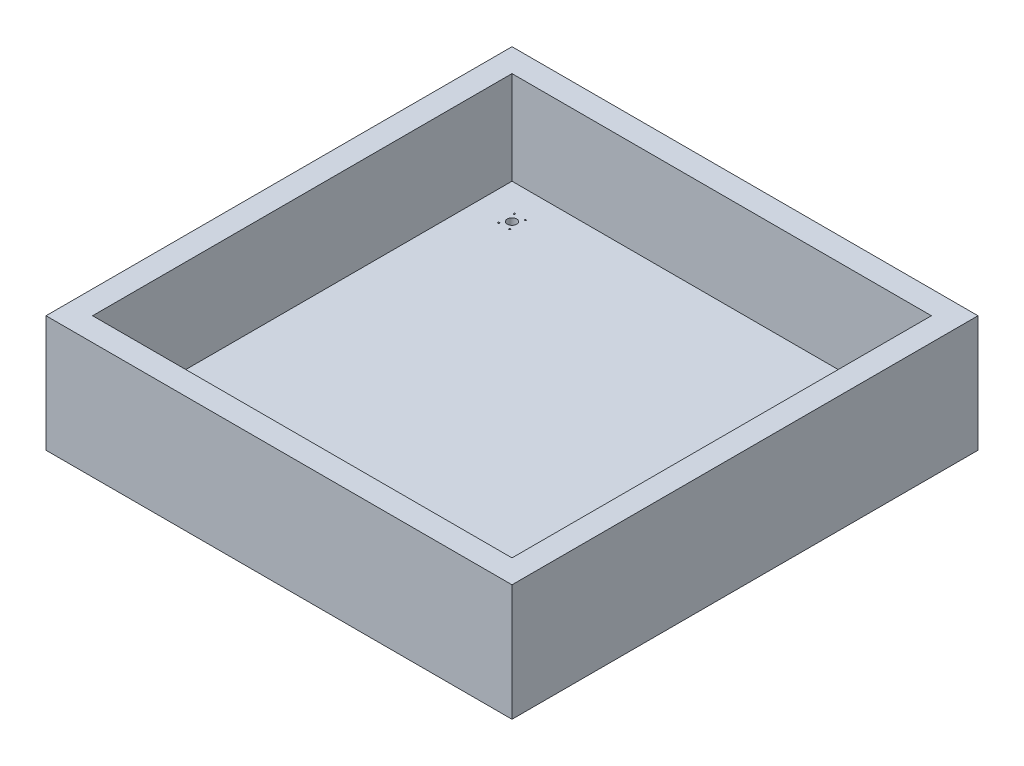
ISO-10303-21;
HEADER;
FILE_DESCRIPTION(('STEP AP214'),'2;1');
FILE_NAME('part.step','',(''),(''),'','','');
FILE_SCHEMA(('AUTOMOTIVE_DESIGN { 1 0 10303 214 1 1 1 1 }'));
ENDSEC;
DATA;
#1=APPLICATION_CONTEXT('core data for automotive mechanical design processes');
#2=APPLICATION_PROTOCOL_DEFINITION('international standard','automotive_design',2000,#1);
#3=PRODUCT_CONTEXT('',#1,'mechanical');
#4=PRODUCT('Part','Part','',(#3));
#5=PRODUCT_RELATED_PRODUCT_CATEGORY('part','',(#4));
#6=PRODUCT_DEFINITION_FORMATION('','',#4);
#7=PRODUCT_DEFINITION_CONTEXT('part definition',#1,'design');
#8=PRODUCT_DEFINITION('design','',#6,#7);
#9=PRODUCT_DEFINITION_SHAPE('','',#8);
#10=(LENGTH_UNIT() NAMED_UNIT(*) SI_UNIT(.MILLI.,.METRE.));
#11=(NAMED_UNIT(*) PLANE_ANGLE_UNIT() SI_UNIT($,.RADIAN.));
#12=(NAMED_UNIT(*) SI_UNIT($,.STERADIAN.) SOLID_ANGLE_UNIT());
#13=UNCERTAINTY_MEASURE_WITH_UNIT(LENGTH_MEASURE(1.E-05),#10,'distance_accuracy_value','');
#14=(GEOMETRIC_REPRESENTATION_CONTEXT(3) GLOBAL_UNCERTAINTY_ASSIGNED_CONTEXT((#13)) GLOBAL_UNIT_ASSIGNED_CONTEXT((#10,
#11,#12)) REPRESENTATION_CONTEXT('',''));
#15=CARTESIAN_POINT('',(0.,0.,0.));
#16=DIRECTION('',(0.,0.,1.));
#17=DIRECTION('',(1.,0.,0.));
#18=AXIS2_PLACEMENT_3D('',#15,#16,#17);
#19=CARTESIAN_POINT('',(0.,0.,0.));
#20=DIRECTION('',(0.,-1.,0.));
#21=DIRECTION('',(0.,0.,-1.));
#22=AXIS2_PLACEMENT_3D('',#19,#20,#21);
#23=PLANE('',#22);
#24=CARTESIAN_POINT('',(-184.596,0.,-199.126));
#25=DIRECTION('',(0.,1.,0.));
#26=DIRECTION('',(0.,0.,1.));
#27=AXIS2_PLACEMENT_3D('',#24,#25,#26);
#28=CIRCLE('',#27,0.799999999999981);
#29=CARTESIAN_POINT('',(-184.596,0.,-198.326));
#30=VERTEX_POINT('',#29);
#31=EDGE_CURVE('E293',#30,#30,#28,.T.);
#32=ORIENTED_EDGE('',*,*,#31,.F.);
#33=EDGE_LOOP('',(#32));
#34=FACE_BOUND('',#33,.T.);
#35=CARTESIAN_POINT('',(-190.5,0.,-190.5));
#36=DIRECTION('',(0.,1.,0.));
#37=DIRECTION('',(0.,0.,1.));
#38=AXIS2_PLACEMENT_3D('',#35,#36,#37);
#39=CIRCLE('',#38,5.07999999999999);
#40=CARTESIAN_POINT('',(-190.5,0.,-185.42));
#41=VERTEX_POINT('',#40);
#42=EDGE_CURVE('E299',#41,#41,#39,.T.);
#43=ORIENTED_EDGE('',*,*,#42,.F.);
#44=EDGE_LOOP('',(#43));
#45=FACE_BOUND('',#44,.T.);
#46=CARTESIAN_POINT('',(-184.596,0.,-182.126));
#47=DIRECTION('',(0.,1.,0.));
#48=DIRECTION('',(0.,0.,1.));
#49=AXIS2_PLACEMENT_3D('',#46,#47,#48);
#50=CIRCLE('',#49,0.799999999999981);
#51=CARTESIAN_POINT('',(-184.596,0.,-181.326));
#52=VERTEX_POINT('',#51);
#53=EDGE_CURVE('E305',#52,#52,#50,.T.);
#54=ORIENTED_EDGE('',*,*,#53,.F.);
#55=EDGE_LOOP('',(#54));
#56=FACE_BOUND('',#55,.T.);
#57=CARTESIAN_POINT('',(-196.596,0.,-182.126));
#58=DIRECTION('',(0.,1.,0.));
#59=DIRECTION('',(0.,0.,1.));
#60=AXIS2_PLACEMENT_3D('',#57,#58,#59);
#61=CIRCLE('',#60,0.799999999999981);
#62=CARTESIAN_POINT('',(-196.596,0.,-181.326));
#63=VERTEX_POINT('',#62);
#64=EDGE_CURVE('E311',#63,#63,#61,.T.);
#65=ORIENTED_EDGE('',*,*,#64,.F.);
#66=EDGE_LOOP('',(#65));
#67=FACE_BOUND('',#66,.T.);
#68=CARTESIAN_POINT('',(190.5,0.,190.5));
#69=DIRECTION('',(0.,1.,0.));
#70=DIRECTION('',(0.,0.,1.));
#71=AXIS2_PLACEMENT_3D('',#68,#69,#70);
#72=CIRCLE('',#71,5.07999999999999);
#73=CARTESIAN_POINT('',(190.5,0.,195.58));
#74=VERTEX_POINT('',#73);
#75=EDGE_CURVE('E279',#74,#74,#72,.T.);
#76=ORIENTED_EDGE('',*,*,#75,.F.);
#77=EDGE_LOOP('',(#76));
#78=FACE_BOUND('',#77,.T.);
#79=CARTESIAN_POINT('',(-196.596,0.,-199.126));
#80=DIRECTION('',(0.,1.,0.));
#81=DIRECTION('',(0.,0.,1.));
#82=AXIS2_PLACEMENT_3D('',#79,#80,#81);
#83=CIRCLE('',#82,0.799999999999981);
#84=CARTESIAN_POINT('',(-196.596,0.,-198.326));
#85=VERTEX_POINT('',#84);
#86=EDGE_CURVE('E132',#85,#85,#83,.T.);
#87=ORIENTED_EDGE('',*,*,#86,.F.);
#88=EDGE_LOOP('',(#87));
#89=FACE_BOUND('',#88,.T.);
#90=DIRECTION('',(-1.,0.,0.));
#91=VECTOR('',#90,1.);
#92=CARTESIAN_POINT('',(228.6,0.,-228.6));
#93=LINE('',#92,#91);
#94=CARTESIAN_POINT('',(228.6,0.,-228.6));
#95=VERTEX_POINT('',#94);
#96=CARTESIAN_POINT('',(-228.6,0.,-228.6));
#97=VERTEX_POINT('',#96);
#98=EDGE_CURVE('E142',#95,#97,#93,.T.);
#99=ORIENTED_EDGE('',*,*,#98,.T.);
#100=DIRECTION('',(0.,0.,1.));
#101=VECTOR('',#100,1.);
#102=CARTESIAN_POINT('',(-228.6,0.,228.6));
#103=LINE('',#102,#101);
#104=CARTESIAN_POINT('',(-228.6,0.,228.6));
#105=VERTEX_POINT('',#104);
#106=EDGE_CURVE('E138',#97,#105,#103,.T.);
#107=ORIENTED_EDGE('',*,*,#106,.T.);
#108=DIRECTION('',(1.,0.,0.));
#109=VECTOR('',#108,1.);
#110=CARTESIAN_POINT('',(228.6,0.,228.6));
#111=LINE('',#110,#109);
#112=CARTESIAN_POINT('',(228.6,0.,228.6));
#113=VERTEX_POINT('',#112);
#114=EDGE_CURVE('E151',#105,#113,#111,.T.);
#115=ORIENTED_EDGE('',*,*,#114,.T.);
#116=DIRECTION('',(0.,0.,-1.));
#117=VECTOR('',#116,1.);
#118=CARTESIAN_POINT('',(228.6,0.,228.6));
#119=LINE('',#118,#117);
#120=EDGE_CURVE('E154',#113,#95,#119,.T.);
#121=ORIENTED_EDGE('',*,*,#120,.T.);
#122=EDGE_LOOP('',(#99,#107,#115,#121));
#123=FACE_BOUND('',#122,.T.);
#124=CARTESIAN_POINT('',(-190.5,0.,190.5));
#125=DIRECTION('',(0.,-1.,0.));
#126=DIRECTION('',(0.,0.,-1.));
#127=AXIS2_PLACEMENT_3D('',#124,#125,#126);
#128=CIRCLE('',#127,5.07999999999999);
#129=CARTESIAN_POINT('',(-190.5,0.,185.42));
#130=VERTEX_POINT('',#129);
#131=EDGE_CURVE('E287',#130,#130,#128,.T.);
#132=ORIENTED_EDGE('',*,*,#131,.T.);
#133=EDGE_LOOP('',(#132));
#134=FACE_BOUND('',#133,.T.);
#135=CARTESIAN_POINT('',(196.596,0.,-199.126));
#136=DIRECTION('',(0.,-1.,0.));
#137=DIRECTION('',(0.,0.,-1.));
#138=AXIS2_PLACEMENT_3D('',#135,#136,#137);
#139=CIRCLE('',#138,0.799999999999981);
#140=CARTESIAN_POINT('',(196.596,0.,-199.926));
#141=VERTEX_POINT('',#140);
#142=EDGE_CURVE('E272',#141,#141,#139,.T.);
#143=ORIENTED_EDGE('',*,*,#142,.T.);
#144=EDGE_LOOP('',(#143));
#145=FACE_BOUND('',#144,.T.);
#146=CARTESIAN_POINT('',(196.596,0.,-182.126));
#147=DIRECTION('',(0.,-1.,0.));
#148=DIRECTION('',(0.,0.,-1.));
#149=AXIS2_PLACEMENT_3D('',#146,#147,#148);
#150=CIRCLE('',#149,0.799999999999981);
#151=CARTESIAN_POINT('',(196.596,0.,-182.926));
#152=VERTEX_POINT('',#151);
#153=EDGE_CURVE('E277',#152,#152,#150,.T.);
#154=ORIENTED_EDGE('',*,*,#153,.T.);
#155=EDGE_LOOP('',(#154));
#156=FACE_BOUND('',#155,.T.);
#157=CARTESIAN_POINT('',(184.596,0.,-182.126));
#158=DIRECTION('',(0.,-1.,0.));
#159=DIRECTION('',(0.,0.,-1.));
#160=AXIS2_PLACEMENT_3D('',#157,#158,#159);
#161=CIRCLE('',#160,0.799999999999981);
#162=CARTESIAN_POINT('',(184.596,0.,-182.926));
#163=VERTEX_POINT('',#162);
#164=EDGE_CURVE('E329',#163,#163,#161,.T.);
#165=ORIENTED_EDGE('',*,*,#164,.T.);
#166=EDGE_LOOP('',(#165));
#167=FACE_BOUND('',#166,.T.);
#168=CARTESIAN_POINT('',(184.596,0.,-199.126));
#169=DIRECTION('',(0.,-1.,0.));
#170=DIRECTION('',(0.,0.,-1.));
#171=AXIS2_PLACEMENT_3D('',#168,#169,#170);
#172=CIRCLE('',#171,0.799999999999981);
#173=CARTESIAN_POINT('',(184.596,0.,-199.926));
#174=VERTEX_POINT('',#173);
#175=EDGE_CURVE('E323',#174,#174,#172,.T.);
#176=ORIENTED_EDGE('',*,*,#175,.T.);
#177=EDGE_LOOP('',(#176));
#178=FACE_BOUND('',#177,.T.);
#179=CARTESIAN_POINT('',(190.5,0.,-190.5));
#180=DIRECTION('',(0.,-1.,0.));
#181=DIRECTION('',(0.,0.,-1.));
#182=AXIS2_PLACEMENT_3D('',#179,#180,#181);
#183=CIRCLE('',#182,5.07999999999999);
#184=CARTESIAN_POINT('',(190.5,0.,-195.58));
#185=VERTEX_POINT('',#184);
#186=EDGE_CURVE('E317',#185,#185,#183,.T.);
#187=ORIENTED_EDGE('',*,*,#186,.T.);
#188=EDGE_LOOP('',(#187));
#189=FACE_BOUND('',#188,.T.);
#190=ADVANCED_FACE('F41',(#34,#45,#56,#67,#78,#89,#123,#134,#145,#156,#167,#178,#189),#23,.F.);
#191=CARTESIAN_POINT('',(0.,-25.4,0.));
#192=DIRECTION('',(0.,-1.,0.));
#193=DIRECTION('',(0.,0.,-1.));
#194=AXIS2_PLACEMENT_3D('',#191,#192,#193);
#195=PLANE('',#194);
#196=CARTESIAN_POINT('',(-184.596,-25.4,-199.126));
#197=DIRECTION('',(0.,1.,0.));
#198=DIRECTION('',(0.,0.,1.));
#199=AXIS2_PLACEMENT_3D('',#196,#197,#198);
#200=CIRCLE('',#199,0.799999999999981);
#201=CARTESIAN_POINT('',(-184.596,-25.4,-198.326));
#202=VERTEX_POINT('',#201);
#203=EDGE_CURVE('E296',#202,#202,#200,.T.);
#204=ORIENTED_EDGE('',*,*,#203,.T.);
#205=EDGE_LOOP('',(#204));
#206=FACE_BOUND('',#205,.T.);
#207=CARTESIAN_POINT('',(-190.5,-25.4,-190.5));
#208=DIRECTION('',(0.,1.,0.));
#209=DIRECTION('',(0.,0.,1.));
#210=AXIS2_PLACEMENT_3D('',#207,#208,#209);
#211=CIRCLE('',#210,5.07999999999999);
#212=CARTESIAN_POINT('',(-190.5,-25.4,-185.42));
#213=VERTEX_POINT('',#212);
#214=EDGE_CURVE('E302',#213,#213,#211,.T.);
#215=ORIENTED_EDGE('',*,*,#214,.T.);
#216=EDGE_LOOP('',(#215));
#217=FACE_BOUND('',#216,.T.);
#218=CARTESIAN_POINT('',(-184.596,-25.4,-182.126));
#219=DIRECTION('',(0.,1.,0.));
#220=DIRECTION('',(0.,0.,1.));
#221=AXIS2_PLACEMENT_3D('',#218,#219,#220);
#222=CIRCLE('',#221,0.799999999999981);
#223=CARTESIAN_POINT('',(-184.596,-25.4,-181.326));
#224=VERTEX_POINT('',#223);
#225=EDGE_CURVE('E308',#224,#224,#222,.T.);
#226=ORIENTED_EDGE('',*,*,#225,.T.);
#227=EDGE_LOOP('',(#226));
#228=FACE_BOUND('',#227,.T.);
#229=CARTESIAN_POINT('',(-196.596,-25.4,-182.126));
#230=DIRECTION('',(0.,1.,0.));
#231=DIRECTION('',(0.,0.,1.));
#232=AXIS2_PLACEMENT_3D('',#229,#230,#231);
#233=CIRCLE('',#232,0.799999999999981);
#234=CARTESIAN_POINT('',(-196.596,-25.4,-181.326));
#235=VERTEX_POINT('',#234);
#236=EDGE_CURVE('E314',#235,#235,#233,.T.);
#237=ORIENTED_EDGE('',*,*,#236,.T.);
#238=EDGE_LOOP('',(#237));
#239=FACE_BOUND('',#238,.T.);
#240=CARTESIAN_POINT('',(184.596,-25.4,-199.126));
#241=DIRECTION('',(0.,-1.,0.));
#242=DIRECTION('',(0.,0.,-1.));
#243=AXIS2_PLACEMENT_3D('',#240,#241,#242);
#244=CIRCLE('',#243,0.799999999999981);
#245=CARTESIAN_POINT('',(184.596,-25.4,-199.926));
#246=VERTEX_POINT('',#245);
#247=EDGE_CURVE('E326',#246,#246,#244,.T.);
#248=ORIENTED_EDGE('',*,*,#247,.F.);
#249=EDGE_LOOP('',(#248));
#250=FACE_BOUND('',#249,.T.);
#251=CARTESIAN_POINT('',(196.596,-25.4,-182.126));
#252=DIRECTION('',(0.,-1.,0.));
#253=DIRECTION('',(0.,0.,-1.));
#254=AXIS2_PLACEMENT_3D('',#251,#252,#253);
#255=CIRCLE('',#254,0.799999999999981);
#256=CARTESIAN_POINT('',(196.596,-25.4,-182.926));
#257=VERTEX_POINT('',#256);
#258=EDGE_CURVE('E274',#257,#257,#255,.T.);
#259=ORIENTED_EDGE('',*,*,#258,.F.);
#260=EDGE_LOOP('',(#259));
#261=FACE_BOUND('',#260,.T.);
#262=CARTESIAN_POINT('',(-190.5,-25.4,190.5));
#263=DIRECTION('',(0.,-1.,0.));
#264=DIRECTION('',(0.,0.,-1.));
#265=AXIS2_PLACEMENT_3D('',#262,#263,#264);
#266=CIRCLE('',#265,5.07999999999999);
#267=CARTESIAN_POINT('',(-190.5,-25.4,185.42));
#268=VERTEX_POINT('',#267);
#269=EDGE_CURVE('E290',#268,#268,#266,.T.);
#270=ORIENTED_EDGE('',*,*,#269,.F.);
#271=EDGE_LOOP('',(#270));
#272=FACE_BOUND('',#271,.T.);
#273=CARTESIAN_POINT('',(-196.596,-25.4,-199.126));
#274=DIRECTION('',(0.,1.,0.));
#275=DIRECTION('',(0.,0.,1.));
#276=AXIS2_PLACEMENT_3D('',#273,#274,#275);
#277=CIRCLE('',#276,0.799999999999981);
#278=CARTESIAN_POINT('',(-196.596,-25.4,-198.326));
#279=VERTEX_POINT('',#278);
#280=EDGE_CURVE('E129',#279,#279,#277,.T.);
#281=ORIENTED_EDGE('',*,*,#280,.T.);
#282=EDGE_LOOP('',(#281));
#283=FACE_BOUND('',#282,.T.);
#284=DIRECTION('',(0.,0.,-1.));
#285=VECTOR('',#284,1.);
#286=CARTESIAN_POINT('',(-254.,-25.4,-254.));
#287=LINE('',#286,#285);
#288=CARTESIAN_POINT('',(-254.,-25.4,254.));
#289=VERTEX_POINT('',#288);
#290=CARTESIAN_POINT('',(-254.,-25.4,-254.));
#291=VERTEX_POINT('',#290);
#292=EDGE_CURVE('E111',#289,#291,#287,.T.);
#293=ORIENTED_EDGE('',*,*,#292,.T.);
#294=DIRECTION('',(1.,0.,0.));
#295=VECTOR('',#294,1.);
#296=CARTESIAN_POINT('',(254.,-25.4,-254.));
#297=LINE('',#296,#295);
#298=CARTESIAN_POINT('',(254.,-25.4,-254.));
#299=VERTEX_POINT('',#298);
#300=EDGE_CURVE('E116',#291,#299,#297,.T.);
#301=ORIENTED_EDGE('',*,*,#300,.T.);
#302=DIRECTION('',(0.,0.,1.));
#303=VECTOR('',#302,1.);
#304=CARTESIAN_POINT('',(254.,-25.4,-254.));
#305=LINE('',#304,#303);
#306=CARTESIAN_POINT('',(254.,-25.4,254.));
#307=VERTEX_POINT('',#306);
#308=EDGE_CURVE('E122',#299,#307,#305,.T.);
#309=ORIENTED_EDGE('',*,*,#308,.T.);
#310=DIRECTION('',(-1.,0.,0.));
#311=VECTOR('',#310,1.);
#312=CARTESIAN_POINT('',(254.,-25.4,254.));
#313=LINE('',#312,#311);
#314=EDGE_CURVE('E128',#307,#289,#313,.T.);
#315=ORIENTED_EDGE('',*,*,#314,.T.);
#316=EDGE_LOOP('',(#293,#301,#309,#315));
#317=FACE_BOUND('',#316,.T.);
#318=CARTESIAN_POINT('',(190.5,-25.4,190.5));
#319=DIRECTION('',(0.,1.,0.));
#320=DIRECTION('',(0.,0.,1.));
#321=AXIS2_PLACEMENT_3D('',#318,#319,#320);
#322=CIRCLE('',#321,5.07999999999999);
#323=CARTESIAN_POINT('',(190.5,-25.4,195.58));
#324=VERTEX_POINT('',#323);
#325=EDGE_CURVE('E284',#324,#324,#322,.T.);
#326=ORIENTED_EDGE('',*,*,#325,.T.);
#327=EDGE_LOOP('',(#326));
#328=FACE_BOUND('',#327,.T.);
#329=CARTESIAN_POINT('',(196.596,-25.4,-199.126));
#330=DIRECTION('',(0.,-1.,0.));
#331=DIRECTION('',(0.,0.,-1.));
#332=AXIS2_PLACEMENT_3D('',#329,#330,#331);
#333=CIRCLE('',#332,0.799999999999981);
#334=CARTESIAN_POINT('',(196.596,-25.4,-199.926));
#335=VERTEX_POINT('',#334);
#336=EDGE_CURVE('E269',#335,#335,#333,.T.);
#337=ORIENTED_EDGE('',*,*,#336,.F.);
#338=EDGE_LOOP('',(#337));
#339=FACE_BOUND('',#338,.T.);
#340=CARTESIAN_POINT('',(184.596,-25.4,-182.126));
#341=DIRECTION('',(0.,-1.,0.));
#342=DIRECTION('',(0.,0.,-1.));
#343=AXIS2_PLACEMENT_3D('',#340,#341,#342);
#344=CIRCLE('',#343,0.799999999999981);
#345=CARTESIAN_POINT('',(184.596,-25.4,-182.926));
#346=VERTEX_POINT('',#345);
#347=EDGE_CURVE('E332',#346,#346,#344,.T.);
#348=ORIENTED_EDGE('',*,*,#347,.F.);
#349=EDGE_LOOP('',(#348));
#350=FACE_BOUND('',#349,.T.);
#351=CARTESIAN_POINT('',(190.5,-25.4,-190.5));
#352=DIRECTION('',(0.,-1.,0.));
#353=DIRECTION('',(0.,0.,-1.));
#354=AXIS2_PLACEMENT_3D('',#351,#352,#353);
#355=CIRCLE('',#354,5.07999999999999);
#356=CARTESIAN_POINT('',(190.5,-25.4,-195.58));
#357=VERTEX_POINT('',#356);
#358=EDGE_CURVE('E320',#357,#357,#355,.T.);
#359=ORIENTED_EDGE('',*,*,#358,.F.);
#360=EDGE_LOOP('',(#359));
#361=FACE_BOUND('',#360,.T.);
#362=ADVANCED_FACE('F125',(#206,#217,#228,#239,#250,#261,#272,#283,#317,#328,#339,#350,#361),
#195,.T.);
#363=CARTESIAN_POINT('',(0.,101.6,0.));
#364=DIRECTION('',(0.,1.,0.));
#365=DIRECTION('',(0.,0.,1.));
#366=AXIS2_PLACEMENT_3D('',#363,#364,#365);
#367=PLANE('',#366);
#368=DIRECTION('',(0.,0.,-1.));
#369=VECTOR('',#368,1.);
#370=CARTESIAN_POINT('',(254.,101.6,254.));
#371=LINE('',#370,#369);
#372=CARTESIAN_POINT('',(254.,101.6,254.));
#373=VERTEX_POINT('',#372);
#374=CARTESIAN_POINT('',(254.,101.6,-254.));
#375=VERTEX_POINT('',#374);
#376=EDGE_CURVE('E166',#373,#375,#371,.T.);
#377=ORIENTED_EDGE('',*,*,#376,.T.);
#378=DIRECTION('',(-1.,0.,0.));
#379=VECTOR('',#378,1.);
#380=CARTESIAN_POINT('',(254.,101.6,-254.));
#381=LINE('',#380,#379);
#382=CARTESIAN_POINT('',(-254.,101.6,-254.));
#383=VERTEX_POINT('',#382);
#384=EDGE_CURVE('E168',#375,#383,#381,.T.);
#385=ORIENTED_EDGE('',*,*,#384,.T.);
#386=DIRECTION('',(0.,0.,1.));
#387=VECTOR('',#386,1.);
#388=CARTESIAN_POINT('',(-254.,101.6,254.));
#389=LINE('',#388,#387);
#390=CARTESIAN_POINT('',(-254.,101.6,254.));
#391=VERTEX_POINT('',#390);
#392=EDGE_CURVE('E112',#383,#391,#389,.T.);
#393=ORIENTED_EDGE('',*,*,#392,.T.);
#394=DIRECTION('',(1.,0.,0.));
#395=VECTOR('',#394,1.);
#396=CARTESIAN_POINT('',(254.,101.6,254.));
#397=LINE('',#396,#395);
#398=EDGE_CURVE('E64',#391,#373,#397,.T.);
#399=ORIENTED_EDGE('',*,*,#398,.T.);
#400=EDGE_LOOP('',(#377,#385,#393,#399));
#401=FACE_BOUND('',#400,.T.);
#402=DIRECTION('',(1.,0.,0.));
#403=VECTOR('',#402,1.);
#404=CARTESIAN_POINT('',(228.6,101.6,228.6));
#405=LINE('',#404,#403);
#406=CARTESIAN_POINT('',(-228.6,101.6,228.6));
#407=VERTEX_POINT('',#406);
#408=CARTESIAN_POINT('',(228.6,101.6,228.6));
#409=VERTEX_POINT('',#408);
#410=EDGE_CURVE('E141',#407,#409,#405,.T.);
#411=ORIENTED_EDGE('',*,*,#410,.F.);
#412=DIRECTION('',(0.,0.,1.));
#413=VECTOR('',#412,1.);
#414=CARTESIAN_POINT('',(-228.6,101.6,228.6));
#415=LINE('',#414,#413);
#416=CARTESIAN_POINT('',(-228.6,101.6,-228.6));
#417=VERTEX_POINT('',#416);
#418=EDGE_CURVE('E139',#417,#407,#415,.T.);
#419=ORIENTED_EDGE('',*,*,#418,.F.);
#420=DIRECTION('',(-1.,0.,0.));
#421=VECTOR('',#420,1.);
#422=CARTESIAN_POINT('',(228.6,101.6,-228.6));
#423=LINE('',#422,#421);
#424=CARTESIAN_POINT('',(228.6,101.6,-228.6));
#425=VERTEX_POINT('',#424);
#426=EDGE_CURVE('E146',#425,#417,#423,.T.);
#427=ORIENTED_EDGE('',*,*,#426,.F.);
#428=DIRECTION('',(0.,0.,-1.));
#429=VECTOR('',#428,1.);
#430=CARTESIAN_POINT('',(228.6,101.6,228.6));
#431=LINE('',#430,#429);
#432=EDGE_CURVE('E144',#409,#425,#431,.T.);
#433=ORIENTED_EDGE('',*,*,#432,.F.);
#434=EDGE_LOOP('',(#411,#419,#427,#433));
#435=FACE_BOUND('',#434,.T.);
#436=ADVANCED_FACE('F178',(#401,#435),#367,.T.);
#437=CARTESIAN_POINT('',(254.,101.6,254.));
#438=DIRECTION('',(-1.,0.,0.));
#439=DIRECTION('',(0.,0.,1.));
#440=AXIS2_PLACEMENT_3D('',#437,#438,#439);
#441=PLANE('',#440);
#442=DIRECTION('',(0.,-1.,0.));
#443=VECTOR('',#442,1.);
#444=CARTESIAN_POINT('',(254.,101.6,254.));
#445=LINE('',#444,#443);
#446=EDGE_CURVE('E172',#373,#307,#445,.T.);
#447=ORIENTED_EDGE('',*,*,#446,.T.);
#448=ORIENTED_EDGE('',*,*,#308,.F.);
#449=DIRECTION('',(0.,-1.,0.));
#450=VECTOR('',#449,1.);
#451=CARTESIAN_POINT('',(254.,101.6,-254.));
#452=LINE('',#451,#450);
#453=EDGE_CURVE('E11',#375,#299,#452,.T.);
#454=ORIENTED_EDGE('',*,*,#453,.F.);
#455=ORIENTED_EDGE('',*,*,#376,.F.);
#456=EDGE_LOOP('',(#447,#448,#454,#455));
#457=FACE_BOUND('',#456,.T.);
#458=ADVANCED_FACE('F43',(#457),#441,.F.);
#459=CARTESIAN_POINT('',(254.,101.6,-254.));
#460=DIRECTION('',(0.,0.,1.));
#461=DIRECTION('',(1.,0.,0.));
#462=AXIS2_PLACEMENT_3D('',#459,#460,#461);
#463=PLANE('',#462);
#464=ORIENTED_EDGE('',*,*,#453,.T.);
#465=ORIENTED_EDGE('',*,*,#300,.F.);
#466=DIRECTION('',(0.,-1.,0.));
#467=VECTOR('',#466,1.);
#468=CARTESIAN_POINT('',(-254.,101.6,-254.));
#469=LINE('',#468,#467);
#470=EDGE_CURVE('E49',#383,#291,#469,.T.);
#471=ORIENTED_EDGE('',*,*,#470,.F.);
#472=ORIENTED_EDGE('',*,*,#384,.F.);
#473=EDGE_LOOP('',(#464,#465,#471,#472));
#474=FACE_BOUND('',#473,.T.);
#475=ADVANCED_FACE('F117',(#474),#463,.F.);
#476=CARTESIAN_POINT('',(-254.,101.6,254.));
#477=DIRECTION('',(1.,0.,0.));
#478=DIRECTION('',(0.,0.,-1.));
#479=AXIS2_PLACEMENT_3D('',#476,#477,#478);
#480=PLANE('',#479);
#481=ORIENTED_EDGE('',*,*,#470,.T.);
#482=ORIENTED_EDGE('',*,*,#292,.F.);
#483=DIRECTION('',(0.,-1.,0.));
#484=VECTOR('',#483,1.);
#485=CARTESIAN_POINT('',(-254.,101.6,254.));
#486=LINE('',#485,#484);
#487=EDGE_CURVE('E114',#391,#289,#486,.T.);
#488=ORIENTED_EDGE('',*,*,#487,.F.);
#489=ORIENTED_EDGE('',*,*,#392,.F.);
#490=EDGE_LOOP('',(#481,#482,#488,#489));
#491=FACE_BOUND('',#490,.T.);
#492=ADVANCED_FACE('F108',(#491),#480,.F.);
#493=CARTESIAN_POINT('',(254.,101.6,254.));
#494=DIRECTION('',(0.,0.,-1.));
#495=DIRECTION('',(-1.,0.,0.));
#496=AXIS2_PLACEMENT_3D('',#493,#494,#495);
#497=PLANE('',#496);
#498=ORIENTED_EDGE('',*,*,#487,.T.);
#499=ORIENTED_EDGE('',*,*,#314,.F.);
#500=ORIENTED_EDGE('',*,*,#446,.F.);
#501=ORIENTED_EDGE('',*,*,#398,.F.);
#502=EDGE_LOOP('',(#498,#499,#500,#501));
#503=FACE_BOUND('',#502,.T.);
#504=ADVANCED_FACE('F175',(#503),#497,.F.);
#505=CARTESIAN_POINT('',(-228.6,101.6,228.6));
#506=DIRECTION('',(1.,0.,0.));
#507=DIRECTION('',(0.,0.,-1.));
#508=AXIS2_PLACEMENT_3D('',#505,#506,#507);
#509=PLANE('',#508);
#510=ORIENTED_EDGE('',*,*,#106,.F.);
#511=DIRECTION('',(0.,-1.,0.));
#512=VECTOR('',#511,1.);
#513=CARTESIAN_POINT('',(-228.6,101.6,-228.6));
#514=LINE('',#513,#512);
#515=EDGE_CURVE('E148',#417,#97,#514,.T.);
#516=ORIENTED_EDGE('',*,*,#515,.F.);
#517=ORIENTED_EDGE('',*,*,#418,.T.);
#518=DIRECTION('',(0.,-1.,0.));
#519=VECTOR('',#518,1.);
#520=CARTESIAN_POINT('',(-228.6,101.6,228.6));
#521=LINE('',#520,#519);
#522=EDGE_CURVE('E163',#407,#105,#521,.T.);
#523=ORIENTED_EDGE('',*,*,#522,.T.);
#524=EDGE_LOOP('',(#510,#516,#517,#523));
#525=FACE_BOUND('',#524,.T.);
#526=ADVANCED_FACE('F197',(#525),#509,.T.);
#527=CARTESIAN_POINT('',(228.6,101.6,228.6));
#528=DIRECTION('',(0.,0.,-1.));
#529=DIRECTION('',(-1.,0.,0.));
#530=AXIS2_PLACEMENT_3D('',#527,#528,#529);
#531=PLANE('',#530);
#532=ORIENTED_EDGE('',*,*,#114,.F.);
#533=ORIENTED_EDGE('',*,*,#522,.F.);
#534=ORIENTED_EDGE('',*,*,#410,.T.);
#535=DIRECTION('',(0.,-1.,0.));
#536=VECTOR('',#535,1.);
#537=CARTESIAN_POINT('',(228.6,101.6,228.6));
#538=LINE('',#537,#536);
#539=EDGE_CURVE('E161',#409,#113,#538,.T.);
#540=ORIENTED_EDGE('',*,*,#539,.T.);
#541=EDGE_LOOP('',(#532,#533,#534,#540));
#542=FACE_BOUND('',#541,.T.);
#543=ADVANCED_FACE('F189',(#542),#531,.T.);
#544=CARTESIAN_POINT('',(228.6,101.6,228.6));
#545=DIRECTION('',(-1.,0.,0.));
#546=DIRECTION('',(0.,0.,1.));
#547=AXIS2_PLACEMENT_3D('',#544,#545,#546);
#548=PLANE('',#547);
#549=ORIENTED_EDGE('',*,*,#120,.F.);
#550=ORIENTED_EDGE('',*,*,#539,.F.);
#551=ORIENTED_EDGE('',*,*,#432,.T.);
#552=DIRECTION('',(0.,-1.,0.));
#553=VECTOR('',#552,1.);
#554=CARTESIAN_POINT('',(228.6,101.6,-228.6));
#555=LINE('',#554,#553);
#556=EDGE_CURVE('E56',#425,#95,#555,.T.);
#557=ORIENTED_EDGE('',*,*,#556,.T.);
#558=EDGE_LOOP('',(#549,#550,#551,#557));
#559=FACE_BOUND('',#558,.T.);
#560=ADVANCED_FACE('F192',(#559),#548,.T.);
#561=CARTESIAN_POINT('',(228.6,101.6,-228.6));
#562=DIRECTION('',(0.,0.,1.));
#563=DIRECTION('',(1.,0.,0.));
#564=AXIS2_PLACEMENT_3D('',#561,#562,#563);
#565=PLANE('',#564);
#566=ORIENTED_EDGE('',*,*,#98,.F.);
#567=ORIENTED_EDGE('',*,*,#556,.F.);
#568=ORIENTED_EDGE('',*,*,#426,.T.);
#569=ORIENTED_EDGE('',*,*,#515,.T.);
#570=EDGE_LOOP('',(#566,#567,#568,#569));
#571=FACE_BOUND('',#570,.T.);
#572=ADVANCED_FACE('F199',(#571),#565,.T.);
#573=CARTESIAN_POINT('',(-196.596,-25.4,-199.126));
#574=DIRECTION('',(0.,1.,0.));
#575=DIRECTION('',(0.,0.,1.));
#576=AXIS2_PLACEMENT_3D('',#573,#574,#575);
#577=CYLINDRICAL_SURFACE('',#576,0.799999999999981);
#578=ORIENTED_EDGE('',*,*,#280,.F.);
#579=EDGE_LOOP('',(#578));
#580=FACE_BOUND('',#579,.T.);
#581=ORIENTED_EDGE('',*,*,#86,.T.);
#582=EDGE_LOOP('',(#581));
#583=FACE_BOUND('',#582,.T.);
#584=ADVANCED_FACE('F201',(#580,#583),#577,.F.);
#585=CARTESIAN_POINT('',(-190.5,-25.4,190.5));
#586=DIRECTION('',(0.,1.,0.));
#587=DIRECTION('',(0.,0.,1.));
#588=AXIS2_PLACEMENT_3D('',#585,#586,#587);
#589=CYLINDRICAL_SURFACE('',#588,5.07999999999999);
#590=ORIENTED_EDGE('',*,*,#269,.T.);
#591=EDGE_LOOP('',(#590));
#592=FACE_BOUND('',#591,.T.);
#593=ORIENTED_EDGE('',*,*,#131,.F.);
#594=EDGE_LOOP('',(#593));
#595=FACE_BOUND('',#594,.T.);
#596=ADVANCED_FACE('F207',(#592,#595),#589,.F.);
#597=CARTESIAN_POINT('',(190.5,-25.4,190.5));
#598=DIRECTION('',(0.,1.,0.));
#599=DIRECTION('',(0.,0.,1.));
#600=AXIS2_PLACEMENT_3D('',#597,#598,#599);
#601=CYLINDRICAL_SURFACE('',#600,5.07999999999999);
#602=ORIENTED_EDGE('',*,*,#325,.F.);
#603=EDGE_LOOP('',(#602));
#604=FACE_BOUND('',#603,.T.);
#605=ORIENTED_EDGE('',*,*,#75,.T.);
#606=EDGE_LOOP('',(#605));
#607=FACE_BOUND('',#606,.T.);
#608=ADVANCED_FACE('F257',(#604,#607),#601,.F.);
#609=CARTESIAN_POINT('',(196.596,-25.4,-199.126));
#610=DIRECTION('',(0.,1.,0.));
#611=DIRECTION('',(0.,0.,1.));
#612=AXIS2_PLACEMENT_3D('',#609,#610,#611);
#613=CYLINDRICAL_SURFACE('',#612,0.799999999999981);
#614=ORIENTED_EDGE('',*,*,#336,.T.);
#615=EDGE_LOOP('',(#614));
#616=FACE_BOUND('',#615,.T.);
#617=ORIENTED_EDGE('',*,*,#142,.F.);
#618=EDGE_LOOP('',(#617));
#619=FACE_BOUND('',#618,.T.);
#620=ADVANCED_FACE('F226',(#616,#619),#613,.F.);
#621=CARTESIAN_POINT('',(196.596,-25.4,-182.126));
#622=DIRECTION('',(0.,1.,0.));
#623=DIRECTION('',(0.,0.,1.));
#624=AXIS2_PLACEMENT_3D('',#621,#622,#623);
#625=CYLINDRICAL_SURFACE('',#624,0.799999999999981);
#626=ORIENTED_EDGE('',*,*,#258,.T.);
#627=EDGE_LOOP('',(#626));
#628=FACE_BOUND('',#627,.T.);
#629=ORIENTED_EDGE('',*,*,#153,.F.);
#630=EDGE_LOOP('',(#629));
#631=FACE_BOUND('',#630,.T.);
#632=ADVANCED_FACE('F222',(#628,#631),#625,.F.);
#633=CARTESIAN_POINT('',(184.596,-25.4,-182.126));
#634=DIRECTION('',(0.,1.,0.));
#635=DIRECTION('',(0.,0.,1.));
#636=AXIS2_PLACEMENT_3D('',#633,#634,#635);
#637=CYLINDRICAL_SURFACE('',#636,0.799999999999981);
#638=ORIENTED_EDGE('',*,*,#347,.T.);
#639=EDGE_LOOP('',(#638));
#640=FACE_BOUND('',#639,.T.);
#641=ORIENTED_EDGE('',*,*,#164,.F.);
#642=EDGE_LOOP('',(#641));
#643=FACE_BOUND('',#642,.T.);
#644=ADVANCED_FACE('F225',(#640,#643),#637,.F.);
#645=CARTESIAN_POINT('',(184.596,-25.4,-199.126));
#646=DIRECTION('',(0.,1.,0.));
#647=DIRECTION('',(0.,0.,1.));
#648=AXIS2_PLACEMENT_3D('',#645,#646,#647);
#649=CYLINDRICAL_SURFACE('',#648,0.799999999999981);
#650=ORIENTED_EDGE('',*,*,#247,.T.);
#651=EDGE_LOOP('',(#650));
#652=FACE_BOUND('',#651,.T.);
#653=ORIENTED_EDGE('',*,*,#175,.F.);
#654=EDGE_LOOP('',(#653));
#655=FACE_BOUND('',#654,.T.);
#656=ADVANCED_FACE('F230',(#652,#655),#649,.F.);
#657=CARTESIAN_POINT('',(190.5,-25.4,-190.5));
#658=DIRECTION('',(0.,1.,0.));
#659=DIRECTION('',(0.,0.,1.));
#660=AXIS2_PLACEMENT_3D('',#657,#658,#659);
#661=CYLINDRICAL_SURFACE('',#660,5.07999999999999);
#662=ORIENTED_EDGE('',*,*,#358,.T.);
#663=EDGE_LOOP('',(#662));
#664=FACE_BOUND('',#663,.T.);
#665=ORIENTED_EDGE('',*,*,#186,.F.);
#666=EDGE_LOOP('',(#665));
#667=FACE_BOUND('',#666,.T.);
#668=ADVANCED_FACE('F234',(#664,#667),#661,.F.);
#669=CARTESIAN_POINT('',(-196.596,-25.4,-182.126));
#670=DIRECTION('',(0.,1.,0.));
#671=DIRECTION('',(0.,0.,1.));
#672=AXIS2_PLACEMENT_3D('',#669,#670,#671);
#673=CYLINDRICAL_SURFACE('',#672,0.799999999999981);
#674=ORIENTED_EDGE('',*,*,#236,.F.);
#675=EDGE_LOOP('',(#674));
#676=FACE_BOUND('',#675,.T.);
#677=ORIENTED_EDGE('',*,*,#64,.T.);
#678=EDGE_LOOP('',(#677));
#679=FACE_BOUND('',#678,.T.);
#680=ADVANCED_FACE('F238',(#676,#679),#673,.F.);
#681=CARTESIAN_POINT('',(-184.596,-25.4,-182.126));
#682=DIRECTION('',(0.,1.,0.));
#683=DIRECTION('',(0.,0.,1.));
#684=AXIS2_PLACEMENT_3D('',#681,#682,#683);
#685=CYLINDRICAL_SURFACE('',#684,0.799999999999981);
#686=ORIENTED_EDGE('',*,*,#225,.F.);
#687=EDGE_LOOP('',(#686));
#688=FACE_BOUND('',#687,.T.);
#689=ORIENTED_EDGE('',*,*,#53,.T.);
#690=EDGE_LOOP('',(#689));
#691=FACE_BOUND('',#690,.T.);
#692=ADVANCED_FACE('F242',(#688,#691),#685,.F.);
#693=CARTESIAN_POINT('',(-190.5,-25.4,-190.5));
#694=DIRECTION('',(0.,1.,0.));
#695=DIRECTION('',(0.,0.,1.));
#696=AXIS2_PLACEMENT_3D('',#693,#694,#695);
#697=CYLINDRICAL_SURFACE('',#696,5.07999999999999);
#698=ORIENTED_EDGE('',*,*,#214,.F.);
#699=EDGE_LOOP('',(#698));
#700=FACE_BOUND('',#699,.T.);
#701=ORIENTED_EDGE('',*,*,#42,.T.);
#702=EDGE_LOOP('',(#701));
#703=FACE_BOUND('',#702,.T.);
#704=ADVANCED_FACE('F246',(#700,#703),#697,.F.);
#705=CARTESIAN_POINT('',(-184.596,-25.4,-199.126));
#706=DIRECTION('',(0.,1.,0.));
#707=DIRECTION('',(0.,0.,1.));
#708=AXIS2_PLACEMENT_3D('',#705,#706,#707);
#709=CYLINDRICAL_SURFACE('',#708,0.799999999999981);
#710=ORIENTED_EDGE('',*,*,#203,.F.);
#711=EDGE_LOOP('',(#710));
#712=FACE_BOUND('',#711,.T.);
#713=ORIENTED_EDGE('',*,*,#31,.T.);
#714=EDGE_LOOP('',(#713));
#715=FACE_BOUND('',#714,.T.);
#716=ADVANCED_FACE('F250',(#712,#715),#709,.F.);
#717=CLOSED_SHELL('',(#190,#362,#436,#458,#475,#492,#504,#526,#543,#560,#572,#584,#596,#608,
#620,#632,#644,#656,#668,#680,#692,#704,#716));
#718=MANIFOLD_SOLID_BREP('B2',#717);
#719=ADVANCED_BREP_SHAPE_REPRESENTATION('',(#18,#718),#14);
#720=SHAPE_DEFINITION_REPRESENTATION(#9,#719);
ENDSEC;
END-ISO-10303-21;
